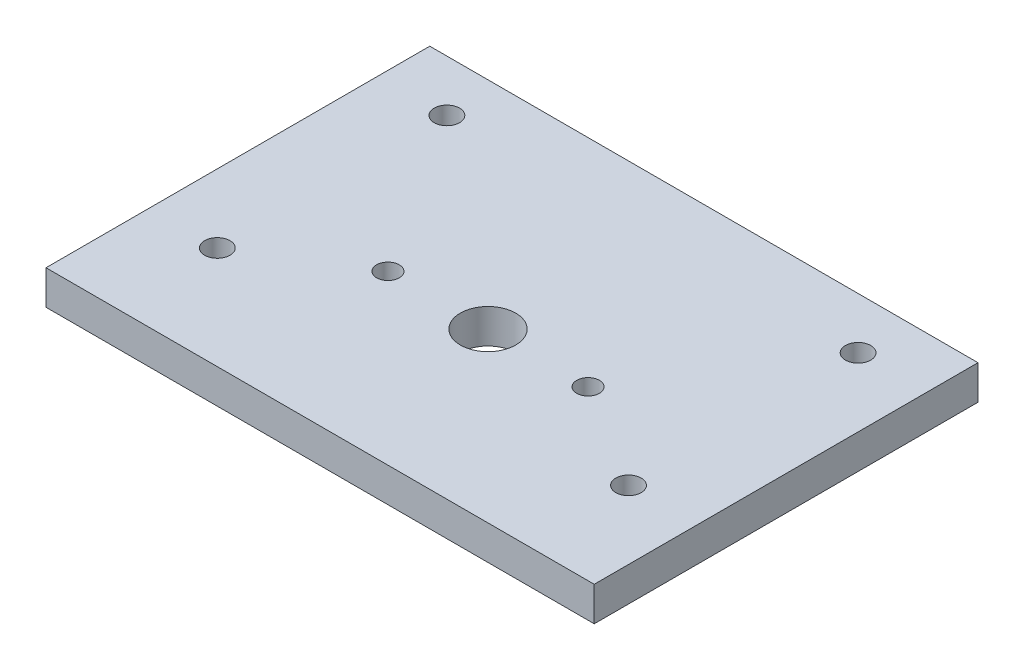
ISO-10303-21;
HEADER;
FILE_DESCRIPTION(('STEP AP214'),'2;1');
FILE_NAME('part.step','',(''),(''),'','','');
FILE_SCHEMA(('AUTOMOTIVE_DESIGN { 1 0 10303 214 1 1 1 1 }'));
ENDSEC;
DATA;
#1=APPLICATION_CONTEXT('core data for automotive mechanical design processes');
#2=APPLICATION_PROTOCOL_DEFINITION('international standard','automotive_design',2000,#1);
#3=PRODUCT_CONTEXT('',#1,'mechanical');
#4=PRODUCT('Part','Part','',(#3));
#5=PRODUCT_RELATED_PRODUCT_CATEGORY('part','',(#4));
#6=PRODUCT_DEFINITION_FORMATION('','',#4);
#7=PRODUCT_DEFINITION_CONTEXT('part definition',#1,'design');
#8=PRODUCT_DEFINITION('design','',#6,#7);
#9=PRODUCT_DEFINITION_SHAPE('','',#8);
#10=(LENGTH_UNIT() NAMED_UNIT(*) SI_UNIT(.MILLI.,.METRE.));
#11=(NAMED_UNIT(*) PLANE_ANGLE_UNIT() SI_UNIT($,.RADIAN.));
#12=(NAMED_UNIT(*) SI_UNIT($,.STERADIAN.) SOLID_ANGLE_UNIT());
#13=UNCERTAINTY_MEASURE_WITH_UNIT(LENGTH_MEASURE(1.E-05),#10,'distance_accuracy_value','');
#14=(GEOMETRIC_REPRESENTATION_CONTEXT(3) GLOBAL_UNCERTAINTY_ASSIGNED_CONTEXT((#13)) GLOBAL_UNIT_ASSIGNED_CONTEXT((#10,
#11,#12)) REPRESENTATION_CONTEXT('',''));
#15=CARTESIAN_POINT('',(0.,0.,0.));
#16=DIRECTION('',(0.,0.,1.));
#17=DIRECTION('',(1.,0.,0.));
#18=AXIS2_PLACEMENT_3D('',#15,#16,#17);
#19=CARTESIAN_POINT('',(0.,6.35,0.));
#20=DIRECTION('',(1.,0.,0.));
#21=DIRECTION('',(0.,0.,-1.));
#22=AXIS2_PLACEMENT_3D('',#19,#20,#21);
#23=PLANE('',#22);
#24=DIRECTION('',(0.,0.,1.));
#25=VECTOR('',#24,1.);
#26=CARTESIAN_POINT('',(0.,0.,0.));
#27=LINE('',#26,#25);
#28=CARTESIAN_POINT('',(0.,0.,-71.12));
#29=VERTEX_POINT('',#28);
#30=CARTESIAN_POINT('',(0.,0.,0.));
#31=VERTEX_POINT('',#30);
#32=EDGE_CURVE('E97',#29,#31,#27,.T.);
#33=ORIENTED_EDGE('',*,*,#32,.T.);
#34=DIRECTION('',(0.,-1.,0.));
#35=VECTOR('',#34,1.);
#36=CARTESIAN_POINT('',(0.,6.35,0.));
#37=LINE('',#36,#35);
#38=CARTESIAN_POINT('',(0.,6.35,0.));
#39=VERTEX_POINT('',#38);
#40=EDGE_CURVE('E11',#39,#31,#37,.T.);
#41=ORIENTED_EDGE('',*,*,#40,.F.);
#42=DIRECTION('',(0.,0.,1.));
#43=VECTOR('',#42,1.);
#44=CARTESIAN_POINT('',(0.,6.35,0.));
#45=LINE('',#44,#43);
#46=CARTESIAN_POINT('',(0.,6.35,-71.12));
#47=VERTEX_POINT('',#46);
#48=EDGE_CURVE('E85',#47,#39,#45,.T.);
#49=ORIENTED_EDGE('',*,*,#48,.F.);
#50=DIRECTION('',(0.,-1.,0.));
#51=VECTOR('',#50,1.);
#52=CARTESIAN_POINT('',(0.,6.35,-71.12));
#53=LINE('',#52,#51);
#54=EDGE_CURVE('E93',#47,#29,#53,.T.);
#55=ORIENTED_EDGE('',*,*,#54,.T.);
#56=EDGE_LOOP('',(#33,#41,#49,#55));
#57=FACE_BOUND('',#56,.T.);
#58=ADVANCED_FACE('F34',(#57),#23,.F.);
#59=CARTESIAN_POINT('',(0.,6.35,0.));
#60=DIRECTION('',(0.,0.,-1.));
#61=DIRECTION('',(-1.,0.,0.));
#62=AXIS2_PLACEMENT_3D('',#59,#60,#61);
#63=PLANE('',#62);
#64=DIRECTION('',(1.,0.,0.));
#65=VECTOR('',#64,1.);
#66=CARTESIAN_POINT('',(0.,0.,0.));
#67=LINE('',#66,#65);
#68=CARTESIAN_POINT('',(101.6,0.,0.));
#69=VERTEX_POINT('',#68);
#70=EDGE_CURVE('E89',#31,#69,#67,.T.);
#71=ORIENTED_EDGE('',*,*,#70,.T.);
#72=DIRECTION('',(0.,-1.,0.));
#73=VECTOR('',#72,1.);
#74=CARTESIAN_POINT('',(101.6,6.35,0.));
#75=LINE('',#74,#73);
#76=CARTESIAN_POINT('',(101.6,6.35,0.));
#77=VERTEX_POINT('',#76);
#78=EDGE_CURVE('E42',#77,#69,#75,.T.);
#79=ORIENTED_EDGE('',*,*,#78,.F.);
#80=DIRECTION('',(1.,0.,0.));
#81=VECTOR('',#80,1.);
#82=CARTESIAN_POINT('',(0.,6.35,0.));
#83=LINE('',#82,#81);
#84=EDGE_CURVE('E80',#39,#77,#83,.T.);
#85=ORIENTED_EDGE('',*,*,#84,.F.);
#86=ORIENTED_EDGE('',*,*,#40,.T.);
#87=EDGE_LOOP('',(#71,#79,#85,#86));
#88=FACE_BOUND('',#87,.T.);
#89=ADVANCED_FACE('F88',(#88),#63,.F.);
#90=CARTESIAN_POINT('',(101.6,6.35,0.));
#91=DIRECTION('',(-1.,0.,0.));
#92=DIRECTION('',(0.,0.,1.));
#93=AXIS2_PLACEMENT_3D('',#90,#91,#92);
#94=PLANE('',#93);
#95=DIRECTION('',(0.,0.,-1.));
#96=VECTOR('',#95,1.);
#97=CARTESIAN_POINT('',(101.6,0.,0.));
#98=LINE('',#97,#96);
#99=CARTESIAN_POINT('',(101.6,0.,-71.12));
#100=VERTEX_POINT('',#99);
#101=EDGE_CURVE('E67',#69,#100,#98,.T.);
#102=ORIENTED_EDGE('',*,*,#101,.T.);
#103=DIRECTION('',(0.,-1.,0.));
#104=VECTOR('',#103,1.);
#105=CARTESIAN_POINT('',(101.6,6.35,-71.12));
#106=LINE('',#105,#104);
#107=CARTESIAN_POINT('',(101.6,6.35,-71.12));
#108=VERTEX_POINT('',#107);
#109=EDGE_CURVE('E90',#108,#100,#106,.T.);
#110=ORIENTED_EDGE('',*,*,#109,.F.);
#111=DIRECTION('',(0.,0.,-1.));
#112=VECTOR('',#111,1.);
#113=CARTESIAN_POINT('',(101.6,6.35,0.));
#114=LINE('',#113,#112);
#115=EDGE_CURVE('E83',#77,#108,#114,.T.);
#116=ORIENTED_EDGE('',*,*,#115,.F.);
#117=ORIENTED_EDGE('',*,*,#78,.T.);
#118=EDGE_LOOP('',(#102,#110,#116,#117));
#119=FACE_BOUND('',#118,.T.);
#120=ADVANCED_FACE('F91',(#119),#94,.F.);
#121=CARTESIAN_POINT('',(0.,6.35,-71.12));
#122=DIRECTION('',(0.,0.,1.));
#123=DIRECTION('',(1.,0.,0.));
#124=AXIS2_PLACEMENT_3D('',#121,#122,#123);
#125=PLANE('',#124);
#126=DIRECTION('',(-1.,0.,0.));
#127=VECTOR('',#126,1.);
#128=CARTESIAN_POINT('',(0.,0.,-71.12));
#129=LINE('',#128,#127);
#130=EDGE_CURVE('E73',#100,#29,#129,.T.);
#131=ORIENTED_EDGE('',*,*,#130,.T.);
#132=ORIENTED_EDGE('',*,*,#54,.F.);
#133=DIRECTION('',(-1.,0.,0.));
#134=VECTOR('',#133,1.);
#135=CARTESIAN_POINT('',(0.,6.35,-71.12));
#136=LINE('',#135,#134);
#137=EDGE_CURVE('E50',#108,#47,#136,.T.);
#138=ORIENTED_EDGE('',*,*,#137,.F.);
#139=ORIENTED_EDGE('',*,*,#109,.T.);
#140=EDGE_LOOP('',(#131,#132,#138,#139));
#141=FACE_BOUND('',#140,.T.);
#142=ADVANCED_FACE('F105',(#141),#125,.F.);
#143=CARTESIAN_POINT('',(0.,6.35,0.));
#144=DIRECTION('',(0.,-1.,0.));
#145=DIRECTION('',(0.,0.,-1.));
#146=AXIS2_PLACEMENT_3D('',#143,#144,#145);
#147=PLANE('',#146);
#148=CARTESIAN_POINT('',(32.258,6.35,-31.115));
#149=DIRECTION('',(0.,1.,0.));
#150=DIRECTION('',(0.,0.,1.));
#151=AXIS2_PLACEMENT_3D('',#148,#149,#150);
#152=CIRCLE('',#151,2.09999999999999);
#153=CARTESIAN_POINT('',(32.258,6.35,-29.015));
#154=VERTEX_POINT('',#153);
#155=EDGE_CURVE('E149',#154,#154,#152,.T.);
#156=ORIENTED_EDGE('',*,*,#155,.F.);
#157=EDGE_LOOP('',(#156));
#158=FACE_BOUND('',#157,.T.);
#159=CARTESIAN_POINT('',(69.342,6.35,-31.115));
#160=DIRECTION('',(0.,1.,0.));
#161=DIRECTION('',(0.,0.,1.));
#162=AXIS2_PLACEMENT_3D('',#159,#160,#161);
#163=CIRCLE('',#162,2.09999999999999);
#164=CARTESIAN_POINT('',(69.342,6.35,-29.015));
#165=VERTEX_POINT('',#164);
#166=EDGE_CURVE('E143',#165,#165,#163,.T.);
#167=ORIENTED_EDGE('',*,*,#166,.F.);
#168=EDGE_LOOP('',(#167));
#169=FACE_BOUND('',#168,.T.);
#170=CARTESIAN_POINT('',(50.8,6.35,-31.115));
#171=DIRECTION('',(0.,1.,0.));
#172=DIRECTION('',(0.,0.,1.));
#173=AXIS2_PLACEMENT_3D('',#170,#171,#172);
#174=CIRCLE('',#173,5.1308);
#175=CARTESIAN_POINT('',(50.8,6.35,-25.9842));
#176=VERTEX_POINT('',#175);
#177=EDGE_CURVE('E137',#176,#176,#174,.T.);
#178=ORIENTED_EDGE('',*,*,#177,.F.);
#179=EDGE_LOOP('',(#178));
#180=FACE_BOUND('',#179,.T.);
#181=CARTESIAN_POINT('',(12.7,6.35,-61.595));
#182=DIRECTION('',(0.,1.,0.));
#183=DIRECTION('',(0.,0.,1.));
#184=AXIS2_PLACEMENT_3D('',#181,#182,#183);
#185=CIRCLE('',#184,2.3495);
#186=CARTESIAN_POINT('',(12.7,6.35,-59.2455));
#187=VERTEX_POINT('',#186);
#188=EDGE_CURVE('E131',#187,#187,#185,.T.);
#189=ORIENTED_EDGE('',*,*,#188,.F.);
#190=EDGE_LOOP('',(#189));
#191=FACE_BOUND('',#190,.T.);
#192=CARTESIAN_POINT('',(88.9,6.35,-61.595));
#193=DIRECTION('',(0.,1.,0.));
#194=DIRECTION('',(0.,0.,1.));
#195=AXIS2_PLACEMENT_3D('',#192,#193,#194);
#196=CIRCLE('',#195,2.3495);
#197=CARTESIAN_POINT('',(88.9,6.35,-59.2455));
#198=VERTEX_POINT('',#197);
#199=EDGE_CURVE('E125',#198,#198,#196,.T.);
#200=ORIENTED_EDGE('',*,*,#199,.F.);
#201=EDGE_LOOP('',(#200));
#202=FACE_BOUND('',#201,.T.);
#203=CARTESIAN_POINT('',(88.9,6.35,-19.05));
#204=DIRECTION('',(0.,1.,0.));
#205=DIRECTION('',(0.,0.,1.));
#206=AXIS2_PLACEMENT_3D('',#203,#204,#205);
#207=CIRCLE('',#206,2.3495);
#208=CARTESIAN_POINT('',(88.9,6.35,-16.7005));
#209=VERTEX_POINT('',#208);
#210=EDGE_CURVE('E119',#209,#209,#207,.T.);
#211=ORIENTED_EDGE('',*,*,#210,.F.);
#212=EDGE_LOOP('',(#211));
#213=FACE_BOUND('',#212,.T.);
#214=CARTESIAN_POINT('',(12.7,6.35,-19.05));
#215=DIRECTION('',(0.,1.,0.));
#216=DIRECTION('',(0.,0.,1.));
#217=AXIS2_PLACEMENT_3D('',#214,#215,#216);
#218=CIRCLE('',#217,2.3495);
#219=CARTESIAN_POINT('',(12.7,6.35,-16.7005));
#220=VERTEX_POINT('',#219);
#221=EDGE_CURVE('E113',#220,#220,#218,.T.);
#222=ORIENTED_EDGE('',*,*,#221,.F.);
#223=EDGE_LOOP('',(#222));
#224=FACE_BOUND('',#223,.T.);
#225=ORIENTED_EDGE('',*,*,#48,.T.);
#226=ORIENTED_EDGE('',*,*,#84,.T.);
#227=ORIENTED_EDGE('',*,*,#115,.T.);
#228=ORIENTED_EDGE('',*,*,#137,.T.);
#229=EDGE_LOOP('',(#225,#226,#227,#228));
#230=FACE_BOUND('',#229,.T.);
#231=ADVANCED_FACE('F81',(#158,#169,#180,#191,#202,#213,#224,#230),#147,.F.);
#232=CARTESIAN_POINT('',(0.,0.,0.));
#233=DIRECTION('',(0.,-1.,0.));
#234=DIRECTION('',(0.,0.,-1.));
#235=AXIS2_PLACEMENT_3D('',#232,#233,#234);
#236=PLANE('',#235);
#237=CARTESIAN_POINT('',(32.258,0.,-31.115));
#238=DIRECTION('',(0.,1.,0.));
#239=DIRECTION('',(0.,0.,1.));
#240=AXIS2_PLACEMENT_3D('',#237,#238,#239);
#241=CIRCLE('',#240,2.1);
#242=CARTESIAN_POINT('',(32.258,0.,-29.015));
#243=VERTEX_POINT('',#242);
#244=EDGE_CURVE('E146',#243,#243,#241,.T.);
#245=ORIENTED_EDGE('',*,*,#244,.T.);
#246=EDGE_LOOP('',(#245));
#247=FACE_BOUND('',#246,.T.);
#248=CARTESIAN_POINT('',(69.342,0.,-31.115));
#249=DIRECTION('',(0.,1.,0.));
#250=DIRECTION('',(0.,0.,1.));
#251=AXIS2_PLACEMENT_3D('',#248,#249,#250);
#252=CIRCLE('',#251,2.1);
#253=CARTESIAN_POINT('',(69.342,0.,-29.015));
#254=VERTEX_POINT('',#253);
#255=EDGE_CURVE('E140',#254,#254,#252,.T.);
#256=ORIENTED_EDGE('',*,*,#255,.T.);
#257=EDGE_LOOP('',(#256));
#258=FACE_BOUND('',#257,.T.);
#259=CARTESIAN_POINT('',(50.8,0.,-31.115));
#260=DIRECTION('',(0.,1.,0.));
#261=DIRECTION('',(0.,0.,1.));
#262=AXIS2_PLACEMENT_3D('',#259,#260,#261);
#263=CIRCLE('',#262,5.1308);
#264=CARTESIAN_POINT('',(50.8,0.,-25.9842));
#265=VERTEX_POINT('',#264);
#266=EDGE_CURVE('E134',#265,#265,#263,.T.);
#267=ORIENTED_EDGE('',*,*,#266,.T.);
#268=EDGE_LOOP('',(#267));
#269=FACE_BOUND('',#268,.T.);
#270=CARTESIAN_POINT('',(12.7,0.,-61.595));
#271=DIRECTION('',(0.,1.,0.));
#272=DIRECTION('',(0.,0.,1.));
#273=AXIS2_PLACEMENT_3D('',#270,#271,#272);
#274=CIRCLE('',#273,2.3495);
#275=CARTESIAN_POINT('',(12.7,0.,-59.2455));
#276=VERTEX_POINT('',#275);
#277=EDGE_CURVE('E128',#276,#276,#274,.T.);
#278=ORIENTED_EDGE('',*,*,#277,.T.);
#279=EDGE_LOOP('',(#278));
#280=FACE_BOUND('',#279,.T.);
#281=CARTESIAN_POINT('',(88.9,0.,-61.595));
#282=DIRECTION('',(0.,1.,0.));
#283=DIRECTION('',(0.,0.,1.));
#284=AXIS2_PLACEMENT_3D('',#281,#282,#283);
#285=CIRCLE('',#284,2.3495);
#286=CARTESIAN_POINT('',(88.9,0.,-59.2455));
#287=VERTEX_POINT('',#286);
#288=EDGE_CURVE('E122',#287,#287,#285,.T.);
#289=ORIENTED_EDGE('',*,*,#288,.T.);
#290=EDGE_LOOP('',(#289));
#291=FACE_BOUND('',#290,.T.);
#292=CARTESIAN_POINT('',(88.9,0.,-19.05));
#293=DIRECTION('',(0.,1.,0.));
#294=DIRECTION('',(0.,0.,1.));
#295=AXIS2_PLACEMENT_3D('',#292,#293,#294);
#296=CIRCLE('',#295,2.3495);
#297=CARTESIAN_POINT('',(88.9,0.,-16.7005));
#298=VERTEX_POINT('',#297);
#299=EDGE_CURVE('E116',#298,#298,#296,.T.);
#300=ORIENTED_EDGE('',*,*,#299,.T.);
#301=EDGE_LOOP('',(#300));
#302=FACE_BOUND('',#301,.T.);
#303=CARTESIAN_POINT('',(12.7,0.,-19.05));
#304=DIRECTION('',(0.,1.,0.));
#305=DIRECTION('',(0.,0.,1.));
#306=AXIS2_PLACEMENT_3D('',#303,#304,#305);
#307=CIRCLE('',#306,2.3495);
#308=CARTESIAN_POINT('',(12.7,0.,-16.7005));
#309=VERTEX_POINT('',#308);
#310=EDGE_CURVE('E100',#309,#309,#307,.T.);
#311=ORIENTED_EDGE('',*,*,#310,.T.);
#312=EDGE_LOOP('',(#311));
#313=FACE_BOUND('',#312,.T.);
#314=ORIENTED_EDGE('',*,*,#32,.F.);
#315=ORIENTED_EDGE('',*,*,#130,.F.);
#316=ORIENTED_EDGE('',*,*,#101,.F.);
#317=ORIENTED_EDGE('',*,*,#70,.F.);
#318=EDGE_LOOP('',(#314,#315,#316,#317));
#319=FACE_BOUND('',#318,.T.);
#320=ADVANCED_FACE('F108',(#247,#258,#269,#280,#291,#302,#313,#319),#236,.T.);
#321=CARTESIAN_POINT('',(12.7,6.35,-19.05));
#322=DIRECTION('',(0.,1.,0.));
#323=DIRECTION('',(0.,0.,1.));
#324=AXIS2_PLACEMENT_3D('',#321,#322,#323);
#325=CYLINDRICAL_SURFACE('',#324,2.3495);
#326=ORIENTED_EDGE('',*,*,#310,.F.);
#327=EDGE_LOOP('',(#326));
#328=FACE_BOUND('',#327,.T.);
#329=ORIENTED_EDGE('',*,*,#221,.T.);
#330=EDGE_LOOP('',(#329));
#331=FACE_BOUND('',#330,.T.);
#332=ADVANCED_FACE('F170',(#328,#331),#325,.F.);
#333=CARTESIAN_POINT('',(88.9,6.35,-19.05));
#334=DIRECTION('',(0.,1.,0.));
#335=DIRECTION('',(0.,0.,1.));
#336=AXIS2_PLACEMENT_3D('',#333,#334,#335);
#337=CYLINDRICAL_SURFACE('',#336,2.3495);
#338=ORIENTED_EDGE('',*,*,#299,.F.);
#339=EDGE_LOOP('',(#338));
#340=FACE_BOUND('',#339,.T.);
#341=ORIENTED_EDGE('',*,*,#210,.T.);
#342=EDGE_LOOP('',(#341));
#343=FACE_BOUND('',#342,.T.);
#344=ADVANCED_FACE('F172',(#340,#343),#337,.F.);
#345=CARTESIAN_POINT('',(88.9,6.35,-61.595));
#346=DIRECTION('',(0.,1.,0.));
#347=DIRECTION('',(0.,0.,1.));
#348=AXIS2_PLACEMENT_3D('',#345,#346,#347);
#349=CYLINDRICAL_SURFACE('',#348,2.3495);
#350=ORIENTED_EDGE('',*,*,#288,.F.);
#351=EDGE_LOOP('',(#350));
#352=FACE_BOUND('',#351,.T.);
#353=ORIENTED_EDGE('',*,*,#199,.T.);
#354=EDGE_LOOP('',(#353));
#355=FACE_BOUND('',#354,.T.);
#356=ADVANCED_FACE('F179',(#352,#355),#349,.F.);
#357=CARTESIAN_POINT('',(12.7,6.35,-61.595));
#358=DIRECTION('',(0.,1.,0.));
#359=DIRECTION('',(0.,0.,1.));
#360=AXIS2_PLACEMENT_3D('',#357,#358,#359);
#361=CYLINDRICAL_SURFACE('',#360,2.3495);
#362=ORIENTED_EDGE('',*,*,#277,.F.);
#363=EDGE_LOOP('',(#362));
#364=FACE_BOUND('',#363,.T.);
#365=ORIENTED_EDGE('',*,*,#188,.T.);
#366=EDGE_LOOP('',(#365));
#367=FACE_BOUND('',#366,.T.);
#368=ADVANCED_FACE('F241',(#364,#367),#361,.F.);
#369=CARTESIAN_POINT('',(50.8,6.35,-31.115));
#370=DIRECTION('',(0.,1.,0.));
#371=DIRECTION('',(0.,0.,1.));
#372=AXIS2_PLACEMENT_3D('',#369,#370,#371);
#373=CYLINDRICAL_SURFACE('',#372,5.1308);
#374=ORIENTED_EDGE('',*,*,#266,.F.);
#375=EDGE_LOOP('',(#374));
#376=FACE_BOUND('',#375,.T.);
#377=ORIENTED_EDGE('',*,*,#177,.T.);
#378=EDGE_LOOP('',(#377));
#379=FACE_BOUND('',#378,.T.);
#380=ADVANCED_FACE('F220',(#376,#379),#373,.F.);
#381=CARTESIAN_POINT('',(69.342,6.35,-31.115));
#382=DIRECTION('',(0.,1.,0.));
#383=DIRECTION('',(0.,0.,1.));
#384=AXIS2_PLACEMENT_3D('',#381,#382,#383);
#385=CYLINDRICAL_SURFACE('',#384,2.1);
#386=ORIENTED_EDGE('',*,*,#255,.F.);
#387=EDGE_LOOP('',(#386));
#388=FACE_BOUND('',#387,.T.);
#389=ORIENTED_EDGE('',*,*,#166,.T.);
#390=EDGE_LOOP('',(#389));
#391=FACE_BOUND('',#390,.T.);
#392=ADVANCED_FACE('F214',(#388,#391),#385,.F.);
#393=CARTESIAN_POINT('',(32.258,6.35,-31.115));
#394=DIRECTION('',(0.,1.,0.));
#395=DIRECTION('',(0.,0.,1.));
#396=AXIS2_PLACEMENT_3D('',#393,#394,#395);
#397=CYLINDRICAL_SURFACE('',#396,2.09999999999999);
#398=ORIENTED_EDGE('',*,*,#244,.F.);
#399=EDGE_LOOP('',(#398));
#400=FACE_BOUND('',#399,.T.);
#401=ORIENTED_EDGE('',*,*,#155,.T.);
#402=EDGE_LOOP('',(#401));
#403=FACE_BOUND('',#402,.T.);
#404=ADVANCED_FACE('F153',(#400,#403),#397,.F.);
#405=CLOSED_SHELL('',(#58,#89,#120,#142,#231,#320,#332,#344,#356,#368,#380,#392,#404));
#406=MANIFOLD_SOLID_BREP('B2',#405);
#407=ADVANCED_BREP_SHAPE_REPRESENTATION('',(#18,#406),#14);
#408=SHAPE_DEFINITION_REPRESENTATION(#9,#407);
ENDSEC;
END-ISO-10303-21;
